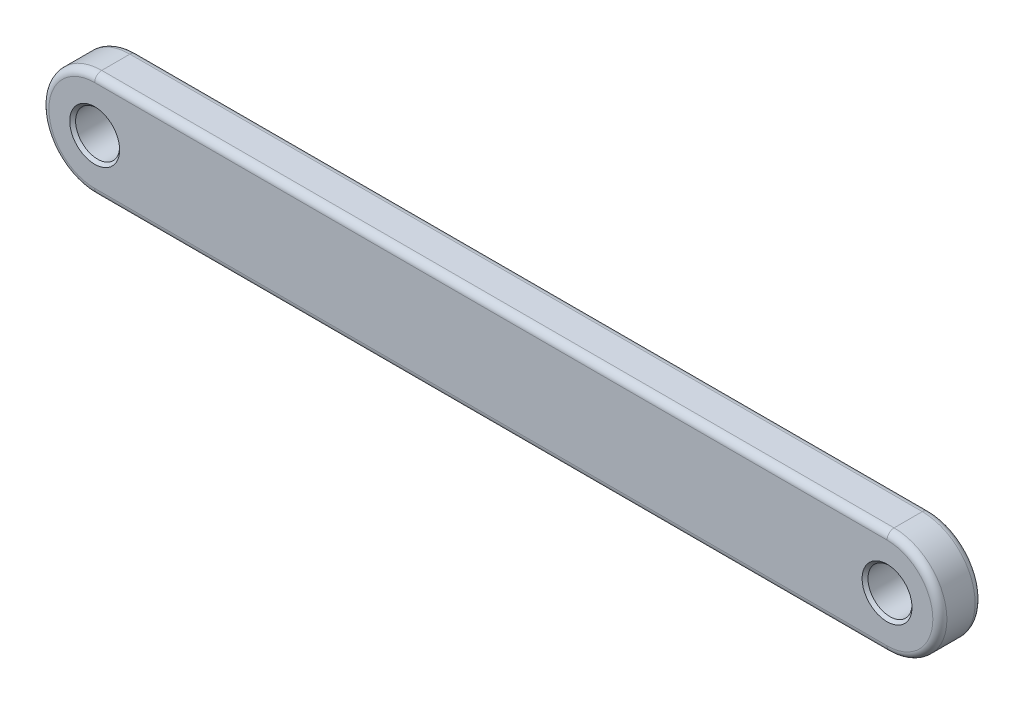
ISO-10303-21;
HEADER;
FILE_DESCRIPTION(('STEP AP214'),'2;1');
FILE_NAME('part.step','',(''),(''),'','','');
FILE_SCHEMA(('AUTOMOTIVE_DESIGN { 1 0 10303 214 1 1 1 1 }'));
ENDSEC;
DATA;
#1=APPLICATION_CONTEXT('core data for automotive mechanical design processes');
#2=APPLICATION_PROTOCOL_DEFINITION('international standard','automotive_design',2000,#1);
#3=PRODUCT_CONTEXT('',#1,'mechanical');
#4=PRODUCT('Part','Part','',(#3));
#5=PRODUCT_RELATED_PRODUCT_CATEGORY('part','',(#4));
#6=PRODUCT_DEFINITION_FORMATION('','',#4);
#7=PRODUCT_DEFINITION_CONTEXT('part definition',#1,'design');
#8=PRODUCT_DEFINITION('design','',#6,#7);
#9=PRODUCT_DEFINITION_SHAPE('','',#8);
#10=(LENGTH_UNIT() NAMED_UNIT(*) SI_UNIT(.MILLI.,.METRE.));
#11=(NAMED_UNIT(*) PLANE_ANGLE_UNIT() SI_UNIT($,.RADIAN.));
#12=(NAMED_UNIT(*) SI_UNIT($,.STERADIAN.) SOLID_ANGLE_UNIT());
#13=UNCERTAINTY_MEASURE_WITH_UNIT(LENGTH_MEASURE(1.E-05),#10,'distance_accuracy_value','');
#14=(GEOMETRIC_REPRESENTATION_CONTEXT(3) GLOBAL_UNCERTAINTY_ASSIGNED_CONTEXT((#13)) GLOBAL_UNIT_ASSIGNED_CONTEXT((#10,
#11,#12)) REPRESENTATION_CONTEXT('',''));
#15=CARTESIAN_POINT('',(0.,0.,0.));
#16=DIRECTION('',(0.,0.,1.));
#17=DIRECTION('',(1.,0.,0.));
#18=AXIS2_PLACEMENT_3D('',#15,#16,#17);
#19=CARTESIAN_POINT('',(-71.4375,0.,0.));
#20=DIRECTION('',(0.,0.,1.));
#21=DIRECTION('',(1.,0.,0.));
#22=AXIS2_PLACEMENT_3D('',#19,#20,#21);
#23=PLANE('',#22);
#24=CARTESIAN_POINT('',(-71.4375,0.,0.));
#25=DIRECTION('',(0.,0.,1.));
#26=DIRECTION('',(1.,0.,0.));
#27=AXIS2_PLACEMENT_3D('',#24,#25,#26);
#28=CIRCLE('',#27,4.49791683599993);
#29=CARTESIAN_POINT('',(-75.9354168359999,0.,0.));
#30=VERTEX_POINT('',#29);
#31=EDGE_CURVE('E177',#30,#30,#28,.T.);
#32=ORIENTED_EDGE('',*,*,#31,.T.);
#33=EDGE_LOOP('',(#32));
#34=FACE_BOUND('',#33,.T.);
#35=CARTESIAN_POINT('',(71.4375,0.,0.));
#36=DIRECTION('',(0.,0.,1.));
#37=DIRECTION('',(1.,0.,0.));
#38=AXIS2_PLACEMENT_3D('',#35,#36,#37);
#39=CIRCLE('',#38,7.14375);
#40=CARTESIAN_POINT('',(78.58125,0.,0.));
#41=VERTEX_POINT('',#40);
#42=EDGE_CURVE('E153',#41,#41,#39,.T.);
#43=ORIENTED_EDGE('',*,*,#42,.T.);
#44=EDGE_LOOP('',(#43));
#45=FACE_BOUND('',#44,.T.);
#46=DIRECTION('',(-1.,0.,0.));
#47=VECTOR('',#46,1.);
#48=CARTESIAN_POINT('',(-71.4375,8.25500000000003,0.));
#49=LINE('',#48,#47);
#50=CARTESIAN_POINT('',(-71.4375,8.25500000000003,0.));
#51=VERTEX_POINT('',#50);
#52=CARTESIAN_POINT('',(71.4375,8.25500000000005,0.));
#53=VERTEX_POINT('',#52);
#54=EDGE_CURVE('E450',#51,#53,#49,.F.);
#55=ORIENTED_EDGE('',*,*,#54,.T.);
#56=CARTESIAN_POINT('',(71.4375,0.,0.));
#57=DIRECTION('',(0.,0.,1.));
#58=DIRECTION('',(1.,0.,0.));
#59=AXIS2_PLACEMENT_3D('',#56,#57,#58);
#60=CIRCLE('',#59,8.25500000000003);
#61=CARTESIAN_POINT('',(71.4375,-8.255,0.));
#62=VERTEX_POINT('',#61);
#63=EDGE_CURVE('E452',#53,#62,#60,.F.);
#64=ORIENTED_EDGE('',*,*,#63,.T.);
#65=DIRECTION('',(1.,0.,0.));
#66=VECTOR('',#65,1.);
#67=CARTESIAN_POINT('',(-71.4375,-8.25500000000003,0.));
#68=LINE('',#67,#66);
#69=CARTESIAN_POINT('',(-71.4375,-8.25500000000003,0.));
#70=VERTEX_POINT('',#69);
#71=EDGE_CURVE('E464',#62,#70,#68,.F.);
#72=ORIENTED_EDGE('',*,*,#71,.T.);
#73=CARTESIAN_POINT('',(-71.4375,0.,0.));
#74=DIRECTION('',(0.,0.,1.));
#75=DIRECTION('',(1.,0.,0.));
#76=AXIS2_PLACEMENT_3D('',#73,#74,#75);
#77=CIRCLE('',#76,8.25500000000003);
#78=EDGE_CURVE('E454',#70,#51,#77,.F.);
#79=ORIENTED_EDGE('',*,*,#78,.T.);
#80=EDGE_LOOP('',(#55,#64,#72,#79));
#81=FACE_BOUND('',#80,.T.);
#82=ADVANCED_FACE('F36',(#34,#45,#81),#23,.F.);
#83=CARTESIAN_POINT('',(-71.4375,0.,7.62));
#84=DIRECTION('',(0.,0.,1.));
#85=DIRECTION('',(1.,0.,0.));
#86=AXIS2_PLACEMENT_3D('',#83,#84,#85);
#87=PLANE('',#86);
#88=CARTESIAN_POINT('',(-71.4375,0.,7.62));
#89=DIRECTION('',(0.,0.,1.));
#90=DIRECTION('',(1.,0.,0.));
#91=AXIS2_PLACEMENT_3D('',#88,#89,#90);
#92=CIRCLE('',#91,4.49791683600008);
#93=CARTESIAN_POINT('',(-66.9395831639999,0.,7.62));
#94=VERTEX_POINT('',#93);
#95=EDGE_CURVE('E165',#94,#94,#92,.F.);
#96=ORIENTED_EDGE('',*,*,#95,.T.);
#97=EDGE_LOOP('',(#96));
#98=FACE_BOUND('',#97,.T.);
#99=CARTESIAN_POINT('',(71.4375,0.,7.62));
#100=DIRECTION('',(0.,0.,1.));
#101=DIRECTION('',(1.,0.,0.));
#102=AXIS2_PLACEMENT_3D('',#99,#100,#101);
#103=CIRCLE('',#102,4.49791683600008);
#104=CARTESIAN_POINT('',(75.9354168360001,0.,7.62));
#105=VERTEX_POINT('',#104);
#106=EDGE_CURVE('E162',#105,#105,#103,.F.);
#107=ORIENTED_EDGE('',*,*,#106,.T.);
#108=EDGE_LOOP('',(#107));
#109=FACE_BOUND('',#108,.T.);
#110=DIRECTION('',(1.,0.,0.));
#111=VECTOR('',#110,1.);
#112=CARTESIAN_POINT('',(71.4375,-8.255,7.62));
#113=LINE('',#112,#111);
#114=CARTESIAN_POINT('',(-71.4375,-8.25500000000003,7.62));
#115=VERTEX_POINT('',#114);
#116=CARTESIAN_POINT('',(71.4375,-8.255,7.62));
#117=VERTEX_POINT('',#116);
#118=EDGE_CURVE('E51',#115,#117,#113,.T.);
#119=ORIENTED_EDGE('',*,*,#118,.T.);
#120=CARTESIAN_POINT('',(71.4375,0.,7.62));
#121=DIRECTION('',(0.,0.,1.));
#122=DIRECTION('',(1.,0.,0.));
#123=AXIS2_PLACEMENT_3D('',#120,#121,#122);
#124=CIRCLE('',#123,8.25500000000003);
#125=CARTESIAN_POINT('',(71.4375,8.25500000000005,7.62));
#126=VERTEX_POINT('',#125);
#127=EDGE_CURVE('E113',#117,#126,#124,.T.);
#128=ORIENTED_EDGE('',*,*,#127,.T.);
#129=DIRECTION('',(-1.,0.,0.));
#130=VECTOR('',#129,1.);
#131=CARTESIAN_POINT('',(-71.4375,8.25500000000003,7.62));
#132=LINE('',#131,#130);
#133=CARTESIAN_POINT('',(-71.4375,8.25500000000003,7.62));
#134=VERTEX_POINT('',#133);
#135=EDGE_CURVE('E137',#126,#134,#132,.T.);
#136=ORIENTED_EDGE('',*,*,#135,.T.);
#137=CARTESIAN_POINT('',(-71.4375,0.,7.62));
#138=DIRECTION('',(0.,0.,1.));
#139=DIRECTION('',(1.,0.,0.));
#140=AXIS2_PLACEMENT_3D('',#137,#138,#139);
#141=CIRCLE('',#140,8.25500000000003);
#142=EDGE_CURVE('E56',#134,#115,#141,.T.);
#143=ORIENTED_EDGE('',*,*,#142,.T.);
#144=EDGE_LOOP('',(#119,#128,#136,#143));
#145=FACE_BOUND('',#144,.T.);
#146=ADVANCED_FACE('F195',(#98,#109,#145),#87,.T.);
#147=CARTESIAN_POINT('',(-71.4375,0.,7.62));
#148=DIRECTION('',(0.,0.,-1.));
#149=DIRECTION('',(-1.,0.,0.));
#150=AXIS2_PLACEMENT_3D('',#147,#148,#149);
#151=CYLINDRICAL_SURFACE('',#150,9.52500000000003);
#152=DIRECTION('',(0.,0.,-1.));
#153=VECTOR('',#152,1.);
#154=CARTESIAN_POINT('',(-71.4375,9.52500000000003,7.62));
#155=LINE('',#154,#153);
#156=CARTESIAN_POINT('',(-71.4375,9.52500000000003,6.35));
#157=VERTEX_POINT('',#156);
#158=CARTESIAN_POINT('',(-71.4375,9.52500000000003,1.27));
#159=VERTEX_POINT('',#158);
#160=EDGE_CURVE('E107',#157,#159,#155,.T.);
#161=ORIENTED_EDGE('',*,*,#160,.T.);
#162=CARTESIAN_POINT('',(-71.4375,0.,1.27));
#163=DIRECTION('',(0.,0.,1.));
#164=DIRECTION('',(1.,0.,0.));
#165=AXIS2_PLACEMENT_3D('',#162,#163,#164);
#166=CIRCLE('',#165,9.52500000000003);
#167=CARTESIAN_POINT('',(-71.4375,-9.52500000000003,1.27));
#168=VERTEX_POINT('',#167);
#169=EDGE_CURVE('E487',#159,#168,#166,.T.);
#170=ORIENTED_EDGE('',*,*,#169,.T.);
#171=DIRECTION('',(0.,0.,-1.));
#172=VECTOR('',#171,1.);
#173=CARTESIAN_POINT('',(-71.4375,-9.52500000000003,7.62));
#174=LINE('',#173,#172);
#175=CARTESIAN_POINT('',(-71.4375,-9.52500000000003,6.35));
#176=VERTEX_POINT('',#175);
#177=EDGE_CURVE('E134',#176,#168,#174,.T.);
#178=ORIENTED_EDGE('',*,*,#177,.F.);
#179=CARTESIAN_POINT('',(-71.4375,0.,6.35));
#180=DIRECTION('',(0.,0.,1.));
#181=DIRECTION('',(1.,0.,0.));
#182=AXIS2_PLACEMENT_3D('',#179,#180,#181);
#183=CIRCLE('',#182,9.52500000000003);
#184=EDGE_CURVE('E485',#176,#157,#183,.F.);
#185=ORIENTED_EDGE('',*,*,#184,.T.);
#186=EDGE_LOOP('',(#161,#170,#178,#185));
#187=FACE_BOUND('',#186,.T.);
#188=ADVANCED_FACE('F201',(#187),#151,.T.);
#189=CARTESIAN_POINT('',(-71.4375,-9.52500000000003,7.62));
#190=DIRECTION('',(0.,1.,0.));
#191=DIRECTION('',(-1.,0.,0.));
#192=AXIS2_PLACEMENT_3D('',#189,#190,#191);
#193=PLANE('',#192);
#194=ORIENTED_EDGE('',*,*,#177,.T.);
#195=DIRECTION('',(1.,0.,0.));
#196=VECTOR('',#195,1.);
#197=CARTESIAN_POINT('',(-71.4375,-9.52500000000003,1.27));
#198=LINE('',#197,#196);
#199=CARTESIAN_POINT('',(71.4375,-9.525,1.27));
#200=VERTEX_POINT('',#199);
#201=EDGE_CURVE('E483',#168,#200,#198,.T.);
#202=ORIENTED_EDGE('',*,*,#201,.T.);
#203=DIRECTION('',(0.,0.,-1.));
#204=VECTOR('',#203,1.);
#205=CARTESIAN_POINT('',(71.4375,-9.525,7.62));
#206=LINE('',#205,#204);
#207=CARTESIAN_POINT('',(71.4375,-9.525,6.35));
#208=VERTEX_POINT('',#207);
#209=EDGE_CURVE('E125',#208,#200,#206,.T.);
#210=ORIENTED_EDGE('',*,*,#209,.F.);
#211=DIRECTION('',(1.,0.,0.));
#212=VECTOR('',#211,1.);
#213=CARTESIAN_POINT('',(-71.4375,-9.52500000000003,6.35));
#214=LINE('',#213,#212);
#215=EDGE_CURVE('E463',#208,#176,#214,.F.);
#216=ORIENTED_EDGE('',*,*,#215,.T.);
#217=EDGE_LOOP('',(#194,#202,#210,#216));
#218=FACE_BOUND('',#217,.T.);
#219=ADVANCED_FACE('F212',(#218),#193,.F.);
#220=CARTESIAN_POINT('',(71.4375,0.,7.62));
#221=DIRECTION('',(0.,0.,-1.));
#222=DIRECTION('',(-1.,0.,0.));
#223=AXIS2_PLACEMENT_3D('',#220,#221,#222);
#224=CYLINDRICAL_SURFACE('',#223,9.52500000000003);
#225=ORIENTED_EDGE('',*,*,#209,.T.);
#226=CARTESIAN_POINT('',(71.4375,0.,1.27));
#227=DIRECTION('',(0.,0.,1.));
#228=DIRECTION('',(1.,0.,0.));
#229=AXIS2_PLACEMENT_3D('',#226,#227,#228);
#230=CIRCLE('',#229,9.52500000000003);
#231=CARTESIAN_POINT('',(71.4375,9.52500000000005,1.27));
#232=VERTEX_POINT('',#231);
#233=EDGE_CURVE('E124',#200,#232,#230,.T.);
#234=ORIENTED_EDGE('',*,*,#233,.T.);
#235=DIRECTION('',(0.,0.,-1.));
#236=VECTOR('',#235,1.);
#237=CARTESIAN_POINT('',(71.4375,9.52500000000005,7.62));
#238=LINE('',#237,#236);
#239=CARTESIAN_POINT('',(71.4375,9.52500000000005,6.35));
#240=VERTEX_POINT('',#239);
#241=EDGE_CURVE('E105',#240,#232,#238,.T.);
#242=ORIENTED_EDGE('',*,*,#241,.F.);
#243=CARTESIAN_POINT('',(71.4375,0.,6.35));
#244=DIRECTION('',(0.,0.,1.));
#245=DIRECTION('',(1.,0.,0.));
#246=AXIS2_PLACEMENT_3D('',#243,#244,#245);
#247=CIRCLE('',#246,9.52500000000003);
#248=EDGE_CURVE('E121',#240,#208,#247,.F.);
#249=ORIENTED_EDGE('',*,*,#248,.T.);
#250=EDGE_LOOP('',(#225,#234,#242,#249));
#251=FACE_BOUND('',#250,.T.);
#252=ADVANCED_FACE('F120',(#251),#224,.T.);
#253=CARTESIAN_POINT('',(-71.4375,9.52500000000003,7.62));
#254=DIRECTION('',(0.,-1.,0.));
#255=DIRECTION('',(1.,0.,0.));
#256=AXIS2_PLACEMENT_3D('',#253,#254,#255);
#257=PLANE('',#256);
#258=ORIENTED_EDGE('',*,*,#241,.T.);
#259=DIRECTION('',(-1.,0.,0.));
#260=VECTOR('',#259,1.);
#261=CARTESIAN_POINT('',(-71.4375,9.52500000000003,1.27));
#262=LINE('',#261,#260);
#263=EDGE_CURVE('E112',#232,#159,#262,.T.);
#264=ORIENTED_EDGE('',*,*,#263,.T.);
#265=ORIENTED_EDGE('',*,*,#160,.F.);
#266=DIRECTION('',(-1.,0.,0.));
#267=VECTOR('',#266,1.);
#268=CARTESIAN_POINT('',(71.4375,9.52500000000005,6.35));
#269=LINE('',#268,#267);
#270=EDGE_CURVE('E102',#157,#240,#269,.F.);
#271=ORIENTED_EDGE('',*,*,#270,.T.);
#272=EDGE_LOOP('',(#258,#264,#265,#271));
#273=FACE_BOUND('',#272,.T.);
#274=ADVANCED_FACE('F104',(#273),#257,.F.);
#275=CARTESIAN_POINT('',(-71.4375,0.,7.62));
#276=DIRECTION('',(0.,0.,-1.));
#277=DIRECTION('',(-1.,0.,0.));
#278=AXIS2_PLACEMENT_3D('',#275,#276,#277);
#279=CYLINDRICAL_SURFACE('',#278,3.96874999999999);
#280=CARTESIAN_POINT('',(-71.4375,0.,7.09083316399991));
#281=DIRECTION('',(0.,0.,1.));
#282=DIRECTION('',(1.,0.,0.));
#283=AXIS2_PLACEMENT_3D('',#280,#281,#282);
#284=CIRCLE('',#283,3.96874999999999);
#285=CARTESIAN_POINT('',(-75.40625,0.,7.09083316399991));
#286=VERTEX_POINT('',#285);
#287=EDGE_CURVE('E159',#286,#286,#284,.T.);
#288=CARTESIAN_POINT('',(-71.4375,0.,0.529166835999935));
#289=DIRECTION('',(0.,0.,1.));
#290=DIRECTION('',(1.,0.,0.));
#291=AXIS2_PLACEMENT_3D('',#288,#289,#290);
#292=CIRCLE('',#291,3.96874999999999);
#293=CARTESIAN_POINT('',(-75.40625,0.,0.529166835999935));
#294=VERTEX_POINT('',#293);
#295=EDGE_CURVE('E156',#294,#294,#292,.F.);
#296=CARTESIAN_POINT('',(-75.40625,0.,7.09083316399991));
#297=CARTESIAN_POINT('',(-75.40625,0.,7.02248247308325));
#298=CARTESIAN_POINT('',(-75.40625,0.,6.95413178216658));
#299=CARTESIAN_POINT('',(-75.40625,0.,6.81743040033325));
#300=CARTESIAN_POINT('',(-75.40625,0.,6.74907970941658));
#301=CARTESIAN_POINT('',(-75.40625,0.,6.61237832758325));
#302=CARTESIAN_POINT('',(-75.40625,0.,6.54402763666658));
#303=CARTESIAN_POINT('',(-75.40625,0.,6.40732625483325));
#304=CARTESIAN_POINT('',(-75.40625,0.,6.33897556391658));
#305=CARTESIAN_POINT('',(-75.40625,0.,6.20227418208325));
#306=CARTESIAN_POINT('',(-75.40625,0.,6.13392349116658));
#307=CARTESIAN_POINT('',(-75.40625,0.,5.99722210933325));
#308=CARTESIAN_POINT('',(-75.40625,0.,5.92887141841658));
#309=CARTESIAN_POINT('',(-75.40625,0.,5.79217003658325));
#310=CARTESIAN_POINT('',(-75.40625,0.,5.72381934566658));
#311=CARTESIAN_POINT('',(-75.40625,0.,5.58711796383325));
#312=CARTESIAN_POINT('',(-75.40625,0.,5.51876727291658));
#313=CARTESIAN_POINT('',(-75.40625,0.,5.38206589108325));
#314=CARTESIAN_POINT('',(-75.40625,0.,5.31371520016659));
#315=CARTESIAN_POINT('',(-75.40625,0.,5.17701381833325));
#316=CARTESIAN_POINT('',(-75.40625,0.,5.10866312741659));
#317=CARTESIAN_POINT('',(-75.40625,0.,4.97196174558325));
#318=CARTESIAN_POINT('',(-75.40625,0.,4.90361105466659));
#319=CARTESIAN_POINT('',(-75.40625,0.,4.76690967283325));
#320=CARTESIAN_POINT('',(-75.40625,0.,4.69855898191659));
#321=CARTESIAN_POINT('',(-75.40625,0.,4.56185760008325));
#322=CARTESIAN_POINT('',(-75.40625,0.,4.49350690916659));
#323=CARTESIAN_POINT('',(-75.40625,0.,4.35680552733325));
#324=CARTESIAN_POINT('',(-75.40625,0.,4.28845483641659));
#325=CARTESIAN_POINT('',(-75.40625,0.,4.15175345458325));
#326=CARTESIAN_POINT('',(-75.40625,0.,4.08340276366659));
#327=CARTESIAN_POINT('',(-75.40625,0.,3.94670138183326));
#328=CARTESIAN_POINT('',(-75.40625,0.,3.87835069091659));
#329=CARTESIAN_POINT('',(-75.40625,0.,3.74164930908326));
#330=CARTESIAN_POINT('',(-75.40625,0.,3.67329861816659));
#331=CARTESIAN_POINT('',(-75.40625,0.,3.53659723633326));
#332=CARTESIAN_POINT('',(-75.40625,0.,3.46824654541659));
#333=CARTESIAN_POINT('',(-75.40625,0.,3.33154516358326));
#334=CARTESIAN_POINT('',(-75.40625,0.,3.26319447266659));
#335=CARTESIAN_POINT('',(-75.40625,0.,3.12649309083326));
#336=CARTESIAN_POINT('',(-75.40625,0.,3.05814239991659));
#337=CARTESIAN_POINT('',(-75.40625,0.,2.92144101808326));
#338=CARTESIAN_POINT('',(-75.40625,0.,2.85309032716659));
#339=CARTESIAN_POINT('',(-75.40625,0.,2.71638894533326));
#340=CARTESIAN_POINT('',(-75.40625,0.,2.64803825441659));
#341=CARTESIAN_POINT('',(-75.40625,0.,2.51133687258326));
#342=CARTESIAN_POINT('',(-75.40625,0.,2.44298618166659));
#343=CARTESIAN_POINT('',(-75.40625,0.,2.30628479983326));
#344=CARTESIAN_POINT('',(-75.40625,0.,2.2379341089166));
#345=CARTESIAN_POINT('',(-75.40625,0.,2.10123272708326));
#346=CARTESIAN_POINT('',(-75.40625,0.,2.0328820361666));
#347=CARTESIAN_POINT('',(-75.40625,0.,1.89618065433326));
#348=CARTESIAN_POINT('',(-75.40625,0.,1.8278299634166));
#349=CARTESIAN_POINT('',(-75.40625,0.,1.69112858158326));
#350=CARTESIAN_POINT('',(-75.40625,0.,1.6227778906666));
#351=CARTESIAN_POINT('',(-75.40625,0.,1.48607650883327));
#352=CARTESIAN_POINT('',(-75.40625,0.,1.4177258179166));
#353=CARTESIAN_POINT('',(-75.40625,0.,1.28102443608327));
#354=CARTESIAN_POINT('',(-75.40625,0.,1.2126737451666));
#355=CARTESIAN_POINT('',(-75.40625,0.,1.07597236333327));
#356=CARTESIAN_POINT('',(-75.40625,0.,1.0076216724166));
#357=CARTESIAN_POINT('',(-75.40625,0.,0.870920290583268));
#358=CARTESIAN_POINT('',(-75.40625,0.,0.802569599666601));
#359=CARTESIAN_POINT('',(-75.40625,0.,0.665868217833268));
#360=CARTESIAN_POINT('',(-75.40625,0.,0.597517526916602));
#361=CARTESIAN_POINT('',(-75.40625,0.,0.529166835999935));
#362=B_SPLINE_CURVE_WITH_KNOTS('',3,(#296,#297,#298,#299,#300,#301,#302,#303,#304,#305,#306,
#307,#308,#309,#310,#311,#312,#313,#314,#315,#316,#317,#318,#319,#320,#321,#322,#323,#324,#325,
#326,#327,#328,#329,#330,#331,#332,#333,#334,#335,#336,#337,#338,#339,#340,#341,#342,#343,#344,
#345,#346,#347,#348,#349,#350,#351,#352,#353,#354,#355,#356,#357,#358,#359,#360,#361),
.UNSPECIFIED.,.F.,.F.,(4,2,2,2,2,2,2,2,2,2,2,2,2,2,2,2,2,2,2,2,2,2,2,2,2,2,2,2,2,2,2,2,4),(0.,
0.205052072749999,0.410104145499998,0.615156218249997,0.820208290999997,1.02526036375,
1.2303124365,1.43536450924999,1.64041658199999,1.84546865474999,2.05052072749999,
2.25557280024999,2.46062487299999,2.66567694574999,2.87072901849999,3.07578109124999,
3.28083316399999,3.48588523674999,3.69093730949999,3.89598938224999,4.10104145499998,
4.30609352774998,4.51114560049998,4.71619767324998,4.92124974599998,5.12630181874998,
5.33135389149998,5.53640596424998,5.74145803699998,5.94651010974998,6.15156218249998,
6.35661425524998,6.56166632799998),.UNSPECIFIED.);
#363=EDGE_CURVE('BSEAM209',#286,#294,#362,.T.);
#364=ORIENTED_EDGE('',*,*,#287,.T.);
#365=ORIENTED_EDGE('',*,*,#295,.T.);
#366=ORIENTED_EDGE('',*,*,#363,.T.);
#367=ORIENTED_EDGE('',*,*,#363,.F.);
#368=EDGE_LOOP('',(#364,#366,#365,#367));
#369=FACE_BOUND('',#368,.T.);
#370=ADVANCED_FACE('F209',(#369),#279,.F.);
#371=CARTESIAN_POINT('',(71.4375,0.,7.62));
#372=DIRECTION('',(0.,0.,-1.));
#373=DIRECTION('',(-1.,0.,0.));
#374=AXIS2_PLACEMENT_3D('',#371,#372,#373);
#375=CYLINDRICAL_SURFACE('',#374,3.96874999999999);
#376=CARTESIAN_POINT('',(71.4375,0.,7.09083316399991));
#377=DIRECTION('',(0.,0.,1.));
#378=DIRECTION('',(1.,0.,0.));
#379=AXIS2_PLACEMENT_3D('',#376,#377,#378);
#380=CIRCLE('',#379,3.96874999999999);
#381=CARTESIAN_POINT('',(67.46875,0.,7.09083316399991));
#382=VERTEX_POINT('',#381);
#383=EDGE_CURVE('E171',#382,#382,#380,.T.);
#384=CARTESIAN_POINT('',(71.4375,0.,-1.58749983066659));
#385=DIRECTION('',(0.,0.,-1.));
#386=DIRECTION('',(-1.,0.,0.));
#387=AXIS2_PLACEMENT_3D('',#384,#385,#386);
#388=CIRCLE('',#387,3.96874999999999);
#389=CARTESIAN_POINT('',(67.46875,0.,-1.58749983066659));
#390=VERTEX_POINT('',#389);
#391=EDGE_CURVE('E168',#390,#390,#388,.T.);
#392=CARTESIAN_POINT('',(67.46875,0.,7.09083316399991));
#393=CARTESIAN_POINT('',(67.46875,0.,7.00043386197214));
#394=CARTESIAN_POINT('',(67.46875,0.,6.91003455994436));
#395=CARTESIAN_POINT('',(67.46875,0.,6.72923595588881));
#396=CARTESIAN_POINT('',(67.46875,0.,6.63883665386103));
#397=CARTESIAN_POINT('',(67.46875,0.,6.45803804980548));
#398=CARTESIAN_POINT('',(67.46875,0.,6.3676387477777));
#399=CARTESIAN_POINT('',(67.46875,0.,6.18684014372215));
#400=CARTESIAN_POINT('',(67.46875,0.,6.09644084169437));
#401=CARTESIAN_POINT('',(67.46875,0.,5.91564223763882));
#402=CARTESIAN_POINT('',(67.46875,0.,5.82524293561105));
#403=CARTESIAN_POINT('',(67.46875,0.,5.64444433155549));
#404=CARTESIAN_POINT('',(67.46875,0.,5.55404502952772));
#405=CARTESIAN_POINT('',(67.46875,0.,5.37324642547217));
#406=CARTESIAN_POINT('',(67.46875,0.,5.28284712344439));
#407=CARTESIAN_POINT('',(67.46875,0.,5.10204851938884));
#408=CARTESIAN_POINT('',(67.46875,0.,5.01164921736106));
#409=CARTESIAN_POINT('',(67.46875,0.,4.83085061330551));
#410=CARTESIAN_POINT('',(67.46875,0.,4.74045131127773));
#411=CARTESIAN_POINT('',(67.46875,0.,4.55965270722218));
#412=CARTESIAN_POINT('',(67.46875,0.,4.46925340519441));
#413=CARTESIAN_POINT('',(67.46875,0.,4.28845480113885));
#414=CARTESIAN_POINT('',(67.46875,0.,4.19805549911108));
#415=CARTESIAN_POINT('',(67.46875,0.,4.01725689505552));
#416=CARTESIAN_POINT('',(67.46875,0.,3.92685759302775));
#417=CARTESIAN_POINT('',(67.46875,0.,3.7460589889722));
#418=CARTESIAN_POINT('',(67.46875,0.,3.65565968694442));
#419=CARTESIAN_POINT('',(67.46875,0.,3.47486108288887));
#420=CARTESIAN_POINT('',(67.46875,0.,3.38446178086109));
#421=CARTESIAN_POINT('',(67.46875,0.,3.20366317680554));
#422=CARTESIAN_POINT('',(67.46875,0.,3.11326387477776));
#423=CARTESIAN_POINT('',(67.46875,0.,2.93246527072221));
#424=CARTESIAN_POINT('',(67.46875,0.,2.84206596869444));
#425=CARTESIAN_POINT('',(67.46875,0.,2.66126736463888));
#426=CARTESIAN_POINT('',(67.46875,0.,2.57086806261111));
#427=CARTESIAN_POINT('',(67.46875,0.,2.39006945855556));
#428=CARTESIAN_POINT('',(67.46875,0.,2.29967015652778));
#429=CARTESIAN_POINT('',(67.46875,0.,2.11887155247223));
#430=CARTESIAN_POINT('',(67.46875,0.,2.02847225044445));
#431=CARTESIAN_POINT('',(67.46875,0.,1.8476736463889));
#432=CARTESIAN_POINT('',(67.46875,0.,1.75727434436112));
#433=CARTESIAN_POINT('',(67.46875,0.,1.57647574030557));
#434=CARTESIAN_POINT('',(67.46875,0.,1.48607643827779));
#435=CARTESIAN_POINT('',(67.46875,0.,1.30527783422224));
#436=CARTESIAN_POINT('',(67.46875,0.,1.21487853219447));
#437=CARTESIAN_POINT('',(67.46875,0.,1.03407992813891));
#438=CARTESIAN_POINT('',(67.46875,0.,0.943680626111139));
#439=CARTESIAN_POINT('',(67.46875,0.,0.762882022055587));
#440=CARTESIAN_POINT('',(67.46875,0.,0.672482720027811));
#441=CARTESIAN_POINT('',(67.46875,0.,0.491684115972258));
#442=CARTESIAN_POINT('',(67.46875,0.,0.401284813944482));
#443=CARTESIAN_POINT('',(67.46875,0.,0.22048620988893));
#444=CARTESIAN_POINT('',(67.46875,0.,0.130086907861153));
#445=CARTESIAN_POINT('',(67.46875,0.,-0.0507116961943983));
#446=CARTESIAN_POINT('',(67.46875,0.,-0.141110998222174));
#447=CARTESIAN_POINT('',(67.46875,0.,-0.321909602277726));
#448=CARTESIAN_POINT('',(67.46875,0.,-0.412308904305501));
#449=CARTESIAN_POINT('',(67.46875,0.,-0.593107508361053));
#450=CARTESIAN_POINT('',(67.46875,0.,-0.68350681038883));
#451=CARTESIAN_POINT('',(67.46875,0.,-0.864305414444382));
#452=CARTESIAN_POINT('',(67.46875,0.,-0.954704716472159));
#453=CARTESIAN_POINT('',(67.46875,0.,-1.13550332052771));
#454=CARTESIAN_POINT('',(67.46875,0.,-1.22590262255549));
#455=CARTESIAN_POINT('',(67.46875,0.,-1.40670122661104));
#456=CARTESIAN_POINT('',(67.46875,0.,-1.49710052863881));
#457=CARTESIAN_POINT('',(67.46875,0.,-1.58749983066659));
#458=B_SPLINE_CURVE_WITH_KNOTS('',3,(#392,#393,#394,#395,#396,#397,#398,#399,#400,#401,#402,
#403,#404,#405,#406,#407,#408,#409,#410,#411,#412,#413,#414,#415,#416,#417,#418,#419,#420,#421,
#422,#423,#424,#425,#426,#427,#428,#429,#430,#431,#432,#433,#434,#435,#436,#437,#438,#439,#440,
#441,#442,#443,#444,#445,#446,#447,#448,#449,#450,#451,#452,#453,#454,#455,#456,#457),
.UNSPECIFIED.,.F.,.F.,(4,2,2,2,2,2,2,2,2,2,2,2,2,2,2,2,2,2,2,2,2,2,2,2,2,2,2,2,2,2,2,2,4),(0.,
0.271197906083328,0.542395812166656,0.813593718249984,1.08479162433331,1.35598953041664,
1.62718743649997,1.8983853425833,2.16958324866663,2.44078115474995,2.71197906083328,
2.98317696691661,3.25437487299994,3.52557277908327,3.79677068516659,4.06796859124992,
4.33916649733325,4.61036440341658,4.88156230949991,5.15276021558324,5.42395812166656,
5.69515602774989,5.96635393383322,6.23755183991655,6.50874974599988,6.77994765208321,
7.05114555816653,7.32234346424986,7.59354137033319,7.86473927641652,8.13593718249985,
8.40713508858317,8.6783329946665),.UNSPECIFIED.);
#459=EDGE_CURVE('BSEAM235',#382,#390,#458,.T.);
#460=ORIENTED_EDGE('',*,*,#383,.T.);
#461=ORIENTED_EDGE('',*,*,#391,.T.);
#462=ORIENTED_EDGE('',*,*,#459,.T.);
#463=ORIENTED_EDGE('',*,*,#459,.F.);
#464=EDGE_LOOP('',(#460,#462,#461,#463));
#465=FACE_BOUND('',#464,.T.);
#466=ADVANCED_FACE('F235',(#465),#375,.F.);
#467=CARTESIAN_POINT('',(-71.4375,0.,1.27));
#468=DIRECTION('',(0.,0.,1.));
#469=DIRECTION('',(1.,0.,0.));
#470=AXIS2_PLACEMENT_3D('',#467,#468,#469);
#471=TOROIDAL_SURFACE('',#470,8.25500000000003,1.27);
#472=CARTESIAN_POINT('',(-71.4375,8.25500000000003,1.27));
#473=DIRECTION('',(1.,0.,0.));
#474=DIRECTION('',(0.,0.,-1.));
#475=AXIS2_PLACEMENT_3D('',#472,#473,#474);
#476=CIRCLE('',#475,1.27);
#477=EDGE_CURVE('E467',#51,#159,#476,.T.);
#478=ORIENTED_EDGE('',*,*,#477,.F.);
#479=ORIENTED_EDGE('',*,*,#78,.F.);
#480=CARTESIAN_POINT('',(-71.4375,-8.25500000000003,1.27));
#481=DIRECTION('',(1.,0.,0.));
#482=DIRECTION('',(0.,0.,-1.));
#483=AXIS2_PLACEMENT_3D('',#480,#481,#482);
#484=CIRCLE('',#483,1.27);
#485=EDGE_CURVE('E142',#168,#70,#484,.T.);
#486=ORIENTED_EDGE('',*,*,#485,.F.);
#487=ORIENTED_EDGE('',*,*,#169,.F.);
#488=EDGE_LOOP('',(#478,#479,#486,#487));
#489=FACE_BOUND('',#488,.T.);
#490=ADVANCED_FACE('F231',(#489),#471,.T.);
#491=CARTESIAN_POINT('',(-71.4375,-8.25500000000003,1.27));
#492=DIRECTION('',(1.,0.,0.));
#493=DIRECTION('',(0.,1.,0.));
#494=AXIS2_PLACEMENT_3D('',#491,#492,#493);
#495=CYLINDRICAL_SURFACE('',#494,1.27);
#496=ORIENTED_EDGE('',*,*,#485,.T.);
#497=ORIENTED_EDGE('',*,*,#71,.F.);
#498=CARTESIAN_POINT('',(71.4375,-8.255,1.27));
#499=DIRECTION('',(1.,0.,0.));
#500=DIRECTION('',(0.,0.,-1.));
#501=AXIS2_PLACEMENT_3D('',#498,#499,#500);
#502=CIRCLE('',#501,1.27);
#503=EDGE_CURVE('E461',#200,#62,#502,.T.);
#504=ORIENTED_EDGE('',*,*,#503,.F.);
#505=ORIENTED_EDGE('',*,*,#201,.F.);
#506=EDGE_LOOP('',(#496,#497,#504,#505));
#507=FACE_BOUND('',#506,.T.);
#508=ADVANCED_FACE('F227',(#507),#495,.T.);
#509=CARTESIAN_POINT('',(-71.4375,8.25500000000003,1.27));
#510=DIRECTION('',(-1.,0.,0.));
#511=DIRECTION('',(0.,-1.,0.));
#512=AXIS2_PLACEMENT_3D('',#509,#510,#511);
#513=CYLINDRICAL_SURFACE('',#512,1.27);
#514=ORIENTED_EDGE('',*,*,#477,.T.);
#515=ORIENTED_EDGE('',*,*,#263,.F.);
#516=CARTESIAN_POINT('',(71.4375,8.25500000000005,1.27));
#517=DIRECTION('',(1.,0.,0.));
#518=DIRECTION('',(0.,0.,-1.));
#519=AXIS2_PLACEMENT_3D('',#516,#517,#518);
#520=CIRCLE('',#519,1.27);
#521=EDGE_CURVE('E149',#53,#232,#520,.T.);
#522=ORIENTED_EDGE('',*,*,#521,.F.);
#523=ORIENTED_EDGE('',*,*,#54,.F.);
#524=EDGE_LOOP('',(#514,#515,#522,#523));
#525=FACE_BOUND('',#524,.T.);
#526=ADVANCED_FACE('F223',(#525),#513,.T.);
#527=CARTESIAN_POINT('',(71.4375,0.,1.27));
#528=DIRECTION('',(0.,0.,1.));
#529=DIRECTION('',(1.,0.,0.));
#530=AXIS2_PLACEMENT_3D('',#527,#528,#529);
#531=TOROIDAL_SURFACE('',#530,8.25500000000003,1.27);
#532=ORIENTED_EDGE('',*,*,#503,.T.);
#533=ORIENTED_EDGE('',*,*,#63,.F.);
#534=ORIENTED_EDGE('',*,*,#521,.T.);
#535=ORIENTED_EDGE('',*,*,#233,.F.);
#536=EDGE_LOOP('',(#532,#533,#534,#535));
#537=FACE_BOUND('',#536,.T.);
#538=ADVANCED_FACE('F219',(#537),#531,.T.);
#539=CARTESIAN_POINT('',(-71.4375,0.,6.35));
#540=DIRECTION('',(0.,0.,1.));
#541=DIRECTION('',(1.,0.,0.));
#542=AXIS2_PLACEMENT_3D('',#539,#540,#541);
#543=TOROIDAL_SURFACE('',#542,8.25500000000003,1.27);
#544=CARTESIAN_POINT('',(-71.4375,8.25500000000003,6.35));
#545=DIRECTION('',(1.,0.,0.));
#546=DIRECTION('',(0.,0.,-1.));
#547=AXIS2_PLACEMENT_3D('',#544,#545,#546);
#548=CIRCLE('',#547,1.27);
#549=EDGE_CURVE('E139',#157,#134,#548,.T.);
#550=ORIENTED_EDGE('',*,*,#549,.F.);
#551=ORIENTED_EDGE('',*,*,#184,.F.);
#552=CARTESIAN_POINT('',(-71.4375,-8.25500000000003,6.35));
#553=DIRECTION('',(1.,0.,0.));
#554=DIRECTION('',(0.,0.,-1.));
#555=AXIS2_PLACEMENT_3D('',#552,#553,#554);
#556=CIRCLE('',#555,1.27);
#557=EDGE_CURVE('E146',#115,#176,#556,.T.);
#558=ORIENTED_EDGE('',*,*,#557,.F.);
#559=ORIENTED_EDGE('',*,*,#142,.F.);
#560=EDGE_LOOP('',(#550,#551,#558,#559));
#561=FACE_BOUND('',#560,.T.);
#562=ADVANCED_FACE('F222',(#561),#543,.T.);
#563=CARTESIAN_POINT('',(-71.4375,-8.25500000000003,6.35));
#564=DIRECTION('',(-1.,0.,0.));
#565=DIRECTION('',(0.,-1.,0.));
#566=AXIS2_PLACEMENT_3D('',#563,#564,#565);
#567=CYLINDRICAL_SURFACE('',#566,1.27);
#568=ORIENTED_EDGE('',*,*,#557,.T.);
#569=ORIENTED_EDGE('',*,*,#215,.F.);
#570=CARTESIAN_POINT('',(71.4375,-8.255,6.35));
#571=DIRECTION('',(1.,0.,0.));
#572=DIRECTION('',(0.,0.,-1.));
#573=AXIS2_PLACEMENT_3D('',#570,#571,#572);
#574=CIRCLE('',#573,1.27);
#575=EDGE_CURVE('E132',#117,#208,#574,.T.);
#576=ORIENTED_EDGE('',*,*,#575,.F.);
#577=ORIENTED_EDGE('',*,*,#118,.F.);
#578=EDGE_LOOP('',(#568,#569,#576,#577));
#579=FACE_BOUND('',#578,.T.);
#580=ADVANCED_FACE('F241',(#579),#567,.T.);
#581=CARTESIAN_POINT('',(-71.4375,8.25500000000003,6.35));
#582=DIRECTION('',(1.,0.,0.));
#583=DIRECTION('',(0.,1.,0.));
#584=AXIS2_PLACEMENT_3D('',#581,#582,#583);
#585=CYLINDRICAL_SURFACE('',#584,1.27);
#586=ORIENTED_EDGE('',*,*,#549,.T.);
#587=ORIENTED_EDGE('',*,*,#135,.F.);
#588=CARTESIAN_POINT('',(71.4375,8.25500000000005,6.35));
#589=DIRECTION('',(1.,0.,0.));
#590=DIRECTION('',(0.,0.,-1.));
#591=AXIS2_PLACEMENT_3D('',#588,#589,#590);
#592=CIRCLE('',#591,1.27);
#593=EDGE_CURVE('E130',#240,#126,#592,.T.);
#594=ORIENTED_EDGE('',*,*,#593,.F.);
#595=ORIENTED_EDGE('',*,*,#270,.F.);
#596=EDGE_LOOP('',(#586,#587,#594,#595));
#597=FACE_BOUND('',#596,.T.);
#598=ADVANCED_FACE('F136',(#597),#585,.T.);
#599=CARTESIAN_POINT('',(71.4375,0.,6.35));
#600=DIRECTION('',(0.,0.,1.));
#601=DIRECTION('',(1.,0.,0.));
#602=AXIS2_PLACEMENT_3D('',#599,#600,#601);
#603=TOROIDAL_SURFACE('',#602,8.25500000000003,1.27);
#604=ORIENTED_EDGE('',*,*,#575,.T.);
#605=ORIENTED_EDGE('',*,*,#248,.F.);
#606=ORIENTED_EDGE('',*,*,#593,.T.);
#607=ORIENTED_EDGE('',*,*,#127,.F.);
#608=EDGE_LOOP('',(#604,#605,#606,#607));
#609=FACE_BOUND('',#608,.T.);
#610=ADVANCED_FACE('F128',(#609),#603,.T.);
#611=CARTESIAN_POINT('',(71.4375,0.,-2.11666666666667));
#612=DIRECTION('',(0.,0.,-1.));
#613=DIRECTION('',(-1.,0.,0.));
#614=AXIS2_PLACEMENT_3D('',#611,#612,#613);
#615=PLANE('',#614);
#616=CARTESIAN_POINT('',(71.4375,0.,-2.11666666666667));
#617=DIRECTION('',(0.,0.,-1.));
#618=DIRECTION('',(-1.,0.,0.));
#619=AXIS2_PLACEMENT_3D('',#616,#617,#618);
#620=CIRCLE('',#619,5.159375);
#621=CARTESIAN_POINT('',(66.278125,0.,-2.11666666666667));
#622=VERTEX_POINT('',#621);
#623=EDGE_CURVE('E44',#622,#622,#620,.T.);
#624=ORIENTED_EDGE('',*,*,#623,.T.);
#625=EDGE_LOOP('',(#624));
#626=FACE_BOUND('',#625,.T.);
#627=CARTESIAN_POINT('',(71.4375,0.,-2.11666666666667));
#628=DIRECTION('',(0.,0.,-1.));
#629=DIRECTION('',(-1.,0.,0.));
#630=AXIS2_PLACEMENT_3D('',#627,#628,#629);
#631=CIRCLE('',#630,4.49791683600007);
#632=CARTESIAN_POINT('',(66.9395831639999,0.,-2.11666666666667));
#633=VERTEX_POINT('',#632);
#634=EDGE_CURVE('E174',#633,#633,#631,.F.);
#635=ORIENTED_EDGE('',*,*,#634,.T.);
#636=EDGE_LOOP('',(#635));
#637=FACE_BOUND('',#636,.T.);
#638=ADVANCED_FACE('F182',(#626,#637),#615,.T.);
#639=CARTESIAN_POINT('',(71.4375,0.,-2.11666666666667));
#640=DIRECTION('',(0.,0.,1.));
#641=DIRECTION('',(1.,0.,0.));
#642=AXIS2_PLACEMENT_3D('',#639,#640,#641);
#643=CYLINDRICAL_SURFACE('',#642,5.55625);
#644=CARTESIAN_POINT('',(71.4375,0.,-1.71979166666667));
#645=DIRECTION('',(0.,0.,-1.));
#646=DIRECTION('',(-1.,0.,0.));
#647=AXIS2_PLACEMENT_3D('',#644,#645,#646);
#648=CIRCLE('',#647,5.55625);
#649=CARTESIAN_POINT('',(65.88125,0.,-1.71979166666667));
#650=VERTEX_POINT('',#649);
#651=EDGE_CURVE('E11',#650,#650,#648,.F.);
#652=ORIENTED_EDGE('',*,*,#651,.T.);
#653=EDGE_LOOP('',(#652));
#654=FACE_BOUND('',#653,.T.);
#655=CARTESIAN_POINT('',(71.4375,0.,-1.5875));
#656=DIRECTION('',(0.,0.,1.));
#657=DIRECTION('',(1.,0.,0.));
#658=AXIS2_PLACEMENT_3D('',#655,#656,#657);
#659=CIRCLE('',#658,5.55625);
#660=CARTESIAN_POINT('',(76.99375,0.,-1.5875));
#661=VERTEX_POINT('',#660);
#662=EDGE_CURVE('E150',#661,#661,#659,.F.);
#663=ORIENTED_EDGE('',*,*,#662,.T.);
#664=EDGE_LOOP('',(#663));
#665=FACE_BOUND('',#664,.T.);
#666=ADVANCED_FACE('F252',(#654,#665),#643,.T.);
#667=CARTESIAN_POINT('',(71.4375,0.,-1.5875));
#668=DIRECTION('',(0.,0.,1.));
#669=DIRECTION('',(1.,0.,0.));
#670=AXIS2_PLACEMENT_3D('',#667,#668,#669);
#671=TOROIDAL_SURFACE('',#670,7.14375,1.5875);
#672=ORIENTED_EDGE('',*,*,#42,.F.);
#673=EDGE_LOOP('',(#672));
#674=FACE_BOUND('',#673,.T.);
#675=ORIENTED_EDGE('',*,*,#662,.F.);
#676=EDGE_LOOP('',(#675));
#677=FACE_BOUND('',#676,.T.);
#678=ADVANCED_FACE('F248',(#674,#677),#671,.F.);
#679=CARTESIAN_POINT('',(-71.4375,0.,7.09083316399991));
#680=DIRECTION('',(0.,0.,1.));
#681=DIRECTION('',(1.,0.,0.));
#682=AXIS2_PLACEMENT_3D('',#679,#680,#681);
#683=CONICAL_SURFACE('',#682,3.96874999999999,0.78539816339745);
#684=ORIENTED_EDGE('',*,*,#95,.F.);
#685=EDGE_LOOP('',(#684));
#686=FACE_BOUND('',#685,.T.);
#687=ORIENTED_EDGE('',*,*,#287,.F.);
#688=EDGE_LOOP('',(#687));
#689=FACE_BOUND('',#688,.T.);
#690=ADVANCED_FACE('F251',(#686,#689),#683,.F.);
#691=CARTESIAN_POINT('',(71.4375,0.,7.09083316399991));
#692=DIRECTION('',(0.,0.,1.));
#693=DIRECTION('',(1.,0.,0.));
#694=AXIS2_PLACEMENT_3D('',#691,#692,#693);
#695=CONICAL_SURFACE('',#694,3.96874999999999,0.78539816339745);
#696=ORIENTED_EDGE('',*,*,#106,.F.);
#697=EDGE_LOOP('',(#696));
#698=FACE_BOUND('',#697,.T.);
#699=ORIENTED_EDGE('',*,*,#383,.F.);
#700=EDGE_LOOP('',(#699));
#701=FACE_BOUND('',#700,.T.);
#702=ADVANCED_FACE('F260',(#698,#701),#695,.F.);
#703=CARTESIAN_POINT('',(71.4375,0.,-1.58749983066659));
#704=DIRECTION('',(0.,0.,-1.));
#705=DIRECTION('',(-1.,0.,0.));
#706=AXIS2_PLACEMENT_3D('',#703,#704,#705);
#707=CONICAL_SURFACE('',#706,3.96874999999999,0.785398163397449);
#708=ORIENTED_EDGE('',*,*,#634,.F.);
#709=EDGE_LOOP('',(#708));
#710=FACE_BOUND('',#709,.T.);
#711=ORIENTED_EDGE('',*,*,#391,.F.);
#712=EDGE_LOOP('',(#711));
#713=FACE_BOUND('',#712,.T.);
#714=ADVANCED_FACE('F191',(#710,#713),#707,.F.);
#715=CARTESIAN_POINT('',(-71.4375,0.,0.));
#716=DIRECTION('',(0.,0.,-1.));
#717=DIRECTION('',(-1.,0.,0.));
#718=AXIS2_PLACEMENT_3D('',#715,#716,#717);
#719=CONICAL_SURFACE('',#718,4.49791683599993,0.785398163397449);
#720=CARTESIAN_POINT('',(-75.40625,0.,0.529166835999935));
#721=CARTESIAN_POINT('',(-75.4117621545417,0.,0.523654681458269));
#722=CARTESIAN_POINT('',(-75.4172743090833,0.,0.518142526916603));
#723=CARTESIAN_POINT('',(-75.4282986181667,0.,0.507118217833271));
#724=CARTESIAN_POINT('',(-75.4338107727083,0.,0.501606063291605));
#725=CARTESIAN_POINT('',(-75.4448350817917,0.,0.490581754208273));
#726=CARTESIAN_POINT('',(-75.4503472363333,0.,0.485069599666607));
#727=CARTESIAN_POINT('',(-75.4613715454167,0.,0.474045290583275));
#728=CARTESIAN_POINT('',(-75.4668836999583,0.,0.468533136041609));
#729=CARTESIAN_POINT('',(-75.4779080090417,0.,0.457508826958277));
#730=CARTESIAN_POINT('',(-75.4834201635833,0.,0.451996672416611));
#731=CARTESIAN_POINT('',(-75.4944444726666,0.,0.440972363333279));
#732=CARTESIAN_POINT('',(-75.4999566272083,0.,0.435460208791613));
#733=CARTESIAN_POINT('',(-75.5109809362916,0.,0.424435899708281));
#734=CARTESIAN_POINT('',(-75.5164930908333,0.,0.418923745166615));
#735=CARTESIAN_POINT('',(-75.5275173999166,0.,0.407899436083283));
#736=CARTESIAN_POINT('',(-75.5330295544583,0.,0.402387281541618));
#737=CARTESIAN_POINT('',(-75.5440538635416,0.,0.391362972458285));
#738=CARTESIAN_POINT('',(-75.5495660180833,0.,0.385850817916618));
#739=CARTESIAN_POINT('',(-75.5605903271666,0.,0.374826508833287));
#740=CARTESIAN_POINT('',(-75.5661024817083,0.,0.369314354291622));
#741=CARTESIAN_POINT('',(-75.5771267907917,0.,0.358290045208291));
#742=CARTESIAN_POINT('',(-75.5826389453333,0.,0.352777890666624));
#743=CARTESIAN_POINT('',(-75.5936632544166,0.,0.341753581583291));
#744=CARTESIAN_POINT('',(-75.5991754089583,0.,0.336241427041625));
#745=CARTESIAN_POINT('',(-75.6101997180416,0.,0.325217117958294));
#746=CARTESIAN_POINT('',(-75.6157118725833,0.,0.319704963416628));
#747=CARTESIAN_POINT('',(-75.6267361816666,0.,0.308680654333296));
#748=CARTESIAN_POINT('',(-75.6322483362083,0.,0.30316849979163));
#749=CARTESIAN_POINT('',(-75.6432726452916,0.,0.292144190708298));
#750=CARTESIAN_POINT('',(-75.6487847998333,0.,0.286632036166632));
#751=CARTESIAN_POINT('',(-75.6598091089166,0.,0.2756077270833));
#752=CARTESIAN_POINT('',(-75.6653212634583,0.,0.270095572541634));
#753=CARTESIAN_POINT('',(-75.6763455725416,0.,0.259071263458302));
#754=CARTESIAN_POINT('',(-75.6818577270833,0.,0.253559108916636));
#755=CARTESIAN_POINT('',(-75.6928820361666,0.,0.242534799833304));
#756=CARTESIAN_POINT('',(-75.6983941907083,0.,0.237022645291638));
#757=CARTESIAN_POINT('',(-75.7094184997916,0.,0.225998336208306));
#758=CARTESIAN_POINT('',(-75.7149306543333,0.,0.22048618166664));
#759=CARTESIAN_POINT('',(-75.7259549634166,0.,0.209461872583308));
#760=CARTESIAN_POINT('',(-75.7314671179583,0.,0.203949718041642));
#761=CARTESIAN_POINT('',(-75.7424914270416,0.,0.19292540895831));
#762=CARTESIAN_POINT('',(-75.7480035815833,0.,0.187413254416644));
#763=CARTESIAN_POINT('',(-75.7590278906666,0.,0.176388945333312));
#764=CARTESIAN_POINT('',(-75.7645400452083,0.,0.170876790791646));
#765=CARTESIAN_POINT('',(-75.7755643542916,0.,0.159852481708314));
#766=CARTESIAN_POINT('',(-75.7810765088333,0.,0.154340327166648));
#767=CARTESIAN_POINT('',(-75.7921008179166,0.,0.143316018083315));
#768=CARTESIAN_POINT('',(-75.7976129724583,0.,0.137803863541648));
#769=CARTESIAN_POINT('',(-75.8086372815416,0.,0.126779554458317));
#770=CARTESIAN_POINT('',(-75.8141494360833,0.,0.121267399916653));
#771=CARTESIAN_POINT('',(-75.8251737451666,0.,0.110243090833321));
#772=CARTESIAN_POINT('',(-75.8306858997083,0.,0.104730936291654));
#773=CARTESIAN_POINT('',(-75.8417102087916,0.,0.0937066272083215));
#774=CARTESIAN_POINT('',(-75.8472223633333,0.,0.0881944726666558));
#775=CARTESIAN_POINT('',(-75.8582466724166,0.,0.077170163583324));
#776=CARTESIAN_POINT('',(-75.8637588269583,0.,0.0716580090416579));
#777=CARTESIAN_POINT('',(-75.8747831360416,0.,0.0606336999583259));
#778=CARTESIAN_POINT('',(-75.8802952905833,0.,0.0551215454166599));
#779=CARTESIAN_POINT('',(-75.8913195996666,0.,0.0440972363333279));
#780=CARTESIAN_POINT('',(-75.8968317542083,0.,0.038585081791662));
#781=CARTESIAN_POINT('',(-75.9078560632916,0.,0.0275607727083299));
#782=CARTESIAN_POINT('',(-75.9133682178333,0.,0.0220486181666639));
#783=CARTESIAN_POINT('',(-75.9243925269166,0.,0.0110243090833319));
#784=CARTESIAN_POINT('',(-75.9299046814583,0.,0.00551215454166596));
#785=CARTESIAN_POINT('',(-75.9354168359999,0.,0.));
#786=B_SPLINE_CURVE_WITH_KNOTS('',3,(#720,#721,#722,#723,#724,#725,#726,#727,#728,#729,#730,
#731,#732,#733,#734,#735,#736,#737,#738,#739,#740,#741,#742,#743,#744,#745,#746,#747,#748,#749,
#750,#751,#752,#753,#754,#755,#756,#757,#758,#759,#760,#761,#762,#763,#764,#765,#766,#767,#768,
#769,#770,#771,#772,#773,#774,#775,#776,#777,#778,#779,#780,#781,#782,#783,#784,#785),
.UNSPECIFIED.,.F.,.F.,(4,2,2,2,2,2,2,2,2,2,2,2,2,2,2,2,2,2,2,2,2,2,2,2,2,2,2,2,2,2,2,2,4),(0.,
0.0233860911321608,0.0467721822643217,0.0701582733964825,0.0935443645286433,0.116930455660804,
0.140316546792965,0.163702637925126,0.187088729057287,0.210474820189448,0.233860911321618,
0.257247002453779,0.28063309358594,0.304019184718101,0.327405275850262,0.350791366982422,
0.374177458114583,0.397563549246744,0.420949640378905,0.444335731511066,0.467721822643227,
0.491107913775388,0.514494004907548,0.537880096039709,0.56126618717187,0.584652278304041,
0.608038369436202,0.631424460568363,0.654810551700523,0.678196642832684,0.701582733964845,
0.724968825097006,0.748354916229167),.UNSPECIFIED.);
#787=EDGE_CURVE('BSEAM186',#294,#30,#786,.T.);
#788=ORIENTED_EDGE('',*,*,#295,.F.);
#789=ORIENTED_EDGE('',*,*,#31,.F.);
#790=ORIENTED_EDGE('',*,*,#787,.T.);
#791=ORIENTED_EDGE('',*,*,#787,.F.);
#792=EDGE_LOOP('',(#788,#790,#789,#791));
#793=FACE_BOUND('',#792,.T.);
#794=ADVANCED_FACE('F186',(#793),#719,.F.);
#795=CARTESIAN_POINT('',(71.4375,0.,-1.71979166666667));
#796=DIRECTION('',(0.,0.,-1.));
#797=DIRECTION('',(-1.,0.,0.));
#798=AXIS2_PLACEMENT_3D('',#795,#796,#797);
#799=TOROIDAL_SURFACE('',#798,5.159375,0.396875);
#800=ORIENTED_EDGE('',*,*,#651,.F.);
#801=EDGE_LOOP('',(#800));
#802=FACE_BOUND('',#801,.T.);
#803=ORIENTED_EDGE('',*,*,#623,.F.);
#804=EDGE_LOOP('',(#803));
#805=FACE_BOUND('',#804,.T.);
#806=ADVANCED_FACE('F38',(#802,#805),#799,.T.);
#807=CLOSED_SHELL('',(#82,#146,#188,#219,#252,#274,#370,#466,#490,#508,#526,#538,#562,#580,#598,
#610,#638,#666,#678,#690,#702,#714,#794,#806));
#808=MANIFOLD_SOLID_BREP('B2',#807);
#809=ADVANCED_BREP_SHAPE_REPRESENTATION('',(#18,#808),#14);
#810=SHAPE_DEFINITION_REPRESENTATION(#9,#809);
ENDSEC;
END-ISO-10303-21;
